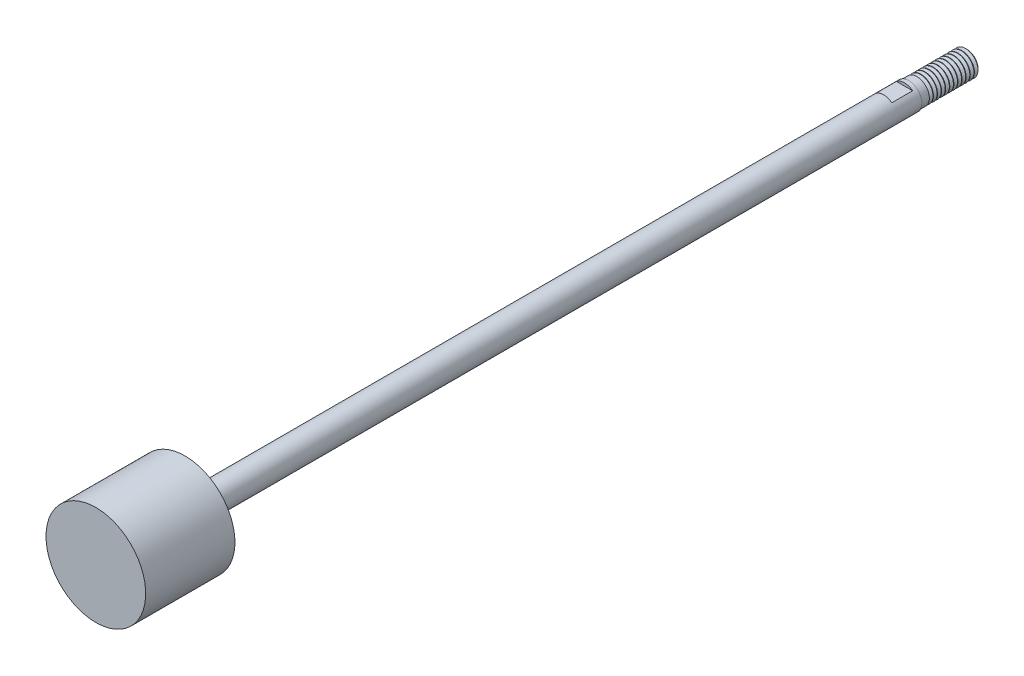
ISO-10303-21;
HEADER;
FILE_DESCRIPTION(('STEP AP214'),'2;1');
FILE_NAME('part.step','',(''),(''),'','','');
FILE_SCHEMA(('AUTOMOTIVE_DESIGN { 1 0 10303 214 1 1 1 1 }'));
ENDSEC;
DATA;
#1=APPLICATION_CONTEXT('core data for automotive mechanical design processes');
#2=APPLICATION_PROTOCOL_DEFINITION('international standard','automotive_design',2000,#1);
#3=PRODUCT_CONTEXT('',#1,'mechanical');
#4=PRODUCT('Part','Part','',(#3));
#5=PRODUCT_RELATED_PRODUCT_CATEGORY('part','',(#4));
#6=PRODUCT_DEFINITION_FORMATION('','',#4);
#7=PRODUCT_DEFINITION_CONTEXT('part definition',#1,'design');
#8=PRODUCT_DEFINITION('design','',#6,#7);
#9=PRODUCT_DEFINITION_SHAPE('','',#8);
#10=(LENGTH_UNIT() NAMED_UNIT(*) SI_UNIT(.MILLI.,.METRE.));
#11=(NAMED_UNIT(*) PLANE_ANGLE_UNIT() SI_UNIT($,.RADIAN.));
#12=(NAMED_UNIT(*) SI_UNIT($,.STERADIAN.) SOLID_ANGLE_UNIT());
#13=UNCERTAINTY_MEASURE_WITH_UNIT(LENGTH_MEASURE(1.E-05),#10,'distance_accuracy_value','');
#14=(GEOMETRIC_REPRESENTATION_CONTEXT(3) GLOBAL_UNCERTAINTY_ASSIGNED_CONTEXT((#13)) GLOBAL_UNIT_ASSIGNED_CONTEXT((#10,
#11,#12)) REPRESENTATION_CONTEXT('',''));
#15=CARTESIAN_POINT('',(0.,0.,0.));
#16=DIRECTION('',(0.,0.,1.));
#17=DIRECTION('',(1.,0.,0.));
#18=AXIS2_PLACEMENT_3D('',#15,#16,#17);
#19=CARTESIAN_POINT('',(0.,0.,0.));
#20=DIRECTION('',(0.,0.,-1.));
#21=DIRECTION('',(-1.,0.,0.));
#22=AXIS2_PLACEMENT_3D('',#19,#20,#21);
#23=PLANE('',#22);
#24=CARTESIAN_POINT('',(0.,0.,-2.8421709430404E-10));
#25=DIRECTION('',(0.,0.,1.));
#26=DIRECTION('',(1.,0.,0.));
#27=AXIS2_PLACEMENT_3D('',#24,#25,#26);
#28=CIRCLE('',#27,2.66992000024402);
#29=CARTESIAN_POINT('',(2.66992000024402,0.,-2.8421709430404E-10));
#30=VERTEX_POINT('',#29);
#31=EDGE_CURVE('E19',#30,#30,#28,.T.);
#32=ORIENTED_EDGE('',*,*,#31,.F.);
#33=EDGE_LOOP('',(#32));
#34=FACE_BOUND('',#33,.T.);
#35=ADVANCED_FACE('F16',(#34),#23,.T.);
#36=CARTESIAN_POINT('',(0.,0.,0.330079999628197));
#37=DIRECTION('',(0.,0.,1.));
#38=DIRECTION('',(1.,0.,0.));
#39=AXIS2_PLACEMENT_3D('',#36,#37,#38);
#40=CONICAL_SURFACE('',#39,2.99999999953116,0.785398162450288);
#41=CARTESIAN_POINT('',(0.,0.,0.33007999968504));
#42=DIRECTION('',(0.,0.,-1.));
#43=DIRECTION('',(-1.,0.,0.));
#44=AXIS2_PLACEMENT_3D('',#41,#42,#43);
#45=CIRCLE('',#44,2.99999999964484);
#46=CARTESIAN_POINT('',(-2.99999999964484,0.,0.33007999968504));
#47=VERTEX_POINT('',#46);
#48=EDGE_CURVE('E196',#47,#47,#45,.F.);
#49=ORIENTED_EDGE('',*,*,#48,.F.);
#50=EDGE_LOOP('',(#49));
#51=FACE_BOUND('',#50,.T.);
#52=ORIENTED_EDGE('',*,*,#31,.T.);
#53=EDGE_LOOP('',(#52));
#54=FACE_BOUND('',#53,.T.);
#55=ADVANCED_FACE('F400',(#51,#54),#40,.T.);
#56=CARTESIAN_POINT('',(0.,0.,0.33007999968504));
#57=DIRECTION('',(0.,0.,-1.));
#58=DIRECTION('',(-1.,0.,0.));
#59=AXIS2_PLACEMENT_3D('',#56,#57,#58);
#60=CONICAL_SURFACE('',#59,2.99999999964484,1.04719755000185);
#61=ORIENTED_EDGE('',*,*,#48,.T.);
#62=EDGE_LOOP('',(#61));
#63=FACE_BOUND('',#62,.T.);
#64=CARTESIAN_POINT('',(0.,0.,0.767579999546797));
#65=DIRECTION('',(0.,0.,1.));
#66=DIRECTION('',(1.,0.,0.));
#67=AXIS2_PLACEMENT_3D('',#64,#65,#66);
#68=CIRCLE('',#67,2.24222777194427);
#69=CARTESIAN_POINT('',(2.24222777194427,0.,0.767579999546797));
#70=VERTEX_POINT('',#69);
#71=EDGE_CURVE('E193',#70,#70,#68,.T.);
#72=ORIENTED_EDGE('',*,*,#71,.F.);
#73=EDGE_LOOP('',(#72));
#74=FACE_BOUND('',#73,.T.);
#75=ADVANCED_FACE('F397',(#63,#74),#60,.T.);
#76=CARTESIAN_POINT('',(0.,0.,1.2050799998633));
#77=DIRECTION('',(0.,0.,1.));
#78=DIRECTION('',(1.,0.,0.));
#79=AXIS2_PLACEMENT_3D('',#76,#77,#78);
#80=CONICAL_SURFACE('',#79,2.99999999884903,1.04719755006448);
#81=CARTESIAN_POINT('',(0.,0.,1.20508));
#82=DIRECTION('',(0.,0.,1.));
#83=DIRECTION('',(1.,0.,0.));
#84=AXIS2_PLACEMENT_3D('',#81,#82,#83);
#85=CIRCLE('',#84,2.99999999999999);
#86=CARTESIAN_POINT('',(2.99999999999999,0.,1.20508));
#87=VERTEX_POINT('',#86);
#88=EDGE_CURVE('E190',#87,#87,#85,.T.);
#89=ORIENTED_EDGE('',*,*,#88,.F.);
#90=EDGE_LOOP('',(#89));
#91=FACE_BOUND('',#90,.T.);
#92=ORIENTED_EDGE('',*,*,#71,.T.);
#93=EDGE_LOOP('',(#92));
#94=FACE_BOUND('',#93,.T.);
#95=ADVANCED_FACE('F393',(#91,#94),#80,.T.);
#96=CARTESIAN_POINT('',(0.,0.,0.));
#97=DIRECTION('',(0.,0.,1.));
#98=DIRECTION('',(1.,0.,0.));
#99=AXIS2_PLACEMENT_3D('',#96,#97,#98);
#100=CYLINDRICAL_SURFACE('',#99,2.99999999999999);
#101=CARTESIAN_POINT('',(0.,0.,1.31445499965821));
#102=DIRECTION('',(0.,0.,-1.));
#103=DIRECTION('',(-1.,0.,0.));
#104=AXIS2_PLACEMENT_3D('',#101,#102,#103);
#105=CIRCLE('',#104,2.99999999975853);
#106=CARTESIAN_POINT('',(-2.99999999975853,0.,1.31445499965821));
#107=VERTEX_POINT('',#106);
#108=EDGE_CURVE('E187',#107,#107,#105,.F.);
#109=ORIENTED_EDGE('',*,*,#108,.F.);
#110=EDGE_LOOP('',(#109));
#111=FACE_BOUND('',#110,.T.);
#112=ORIENTED_EDGE('',*,*,#88,.T.);
#113=EDGE_LOOP('',(#112));
#114=FACE_BOUND('',#113,.T.);
#115=ADVANCED_FACE('F389',(#111,#114),#100,.T.);
#116=CARTESIAN_POINT('',(0.,0.,1.31445499965821));
#117=DIRECTION('',(0.,0.,-1.));
#118=DIRECTION('',(-1.,0.,0.));
#119=AXIS2_PLACEMENT_3D('',#116,#117,#118);
#120=CONICAL_SURFACE('',#119,2.99999999975853,1.04719755001055);
#121=ORIENTED_EDGE('',*,*,#108,.T.);
#122=EDGE_LOOP('',(#121));
#123=FACE_BOUND('',#122,.T.);
#124=CARTESIAN_POINT('',(0.,0.,1.75195499957681));
#125=DIRECTION('',(0.,0.,1.));
#126=DIRECTION('',(1.,0.,0.));
#127=AXIS2_PLACEMENT_3D('',#124,#125,#126);
#128=CIRCLE('',#127,2.24222777194427);
#129=CARTESIAN_POINT('',(2.24222777194427,0.,1.75195499957681));
#130=VERTEX_POINT('',#129);
#131=EDGE_CURVE('E184',#130,#130,#128,.T.);
#132=ORIENTED_EDGE('',*,*,#131,.F.);
#133=EDGE_LOOP('',(#132));
#134=FACE_BOUND('',#133,.T.);
#135=ADVANCED_FACE('F385',(#123,#134),#120,.T.);
#136=CARTESIAN_POINT('',(0.,0.,2.18945499983647));
#137=DIRECTION('',(0.,0.,1.));
#138=DIRECTION('',(1.,0.,0.));
#139=AXIS2_PLACEMENT_3D('',#136,#137,#138);
#140=CONICAL_SURFACE('',#139,2.99999999873535,1.04719755005578);
#141=CARTESIAN_POINT('',(0.,0.,2.18945500000001));
#142=DIRECTION('',(0.,0.,1.));
#143=DIRECTION('',(1.,0.,0.));
#144=AXIS2_PLACEMENT_3D('',#141,#142,#143);
#145=CIRCLE('',#144,2.99999999999999);
#146=CARTESIAN_POINT('',(2.99999999999999,0.,2.18945500000001));
#147=VERTEX_POINT('',#146);
#148=EDGE_CURVE('E181',#147,#147,#145,.T.);
#149=ORIENTED_EDGE('',*,*,#148,.F.);
#150=EDGE_LOOP('',(#149));
#151=FACE_BOUND('',#150,.T.);
#152=ORIENTED_EDGE('',*,*,#131,.T.);
#153=EDGE_LOOP('',(#152));
#154=FACE_BOUND('',#153,.T.);
#155=ADVANCED_FACE('F381',(#151,#154),#140,.T.);
#156=CARTESIAN_POINT('',(0.,0.,0.));
#157=DIRECTION('',(0.,0.,1.));
#158=DIRECTION('',(1.,0.,0.));
#159=AXIS2_PLACEMENT_3D('',#156,#157,#158);
#160=CYLINDRICAL_SURFACE('',#159,2.99999999999999);
#161=CARTESIAN_POINT('',(0.,0.,2.29882999957454));
#162=DIRECTION('',(0.,0.,-1.));
#163=DIRECTION('',(-1.,0.,0.));
#164=AXIS2_PLACEMENT_3D('',#161,#162,#163);
#165=CIRCLE('',#164,2.99999999975853);
#166=CARTESIAN_POINT('',(-2.99999999975853,0.,2.29882999957454));
#167=VERTEX_POINT('',#166);
#168=EDGE_CURVE('E178',#167,#167,#165,.F.);
#169=ORIENTED_EDGE('',*,*,#168,.F.);
#170=EDGE_LOOP('',(#169));
#171=FACE_BOUND('',#170,.T.);
#172=ORIENTED_EDGE('',*,*,#148,.T.);
#173=EDGE_LOOP('',(#172));
#174=FACE_BOUND('',#173,.T.);
#175=ADVANCED_FACE('F377',(#171,#174),#160,.T.);
#176=CARTESIAN_POINT('',(0.,0.,2.29882999968822));
#177=DIRECTION('',(0.,0.,-1.));
#178=DIRECTION('',(-1.,0.,0.));
#179=AXIS2_PLACEMENT_3D('',#176,#177,#178);
#180=CONICAL_SURFACE('',#179,2.999999999588,1.04719755001055);
#181=ORIENTED_EDGE('',*,*,#168,.T.);
#182=EDGE_LOOP('',(#181));
#183=FACE_BOUND('',#182,.T.);
#184=CARTESIAN_POINT('',(0.,0.,2.73632999954998));
#185=DIRECTION('',(0.,0.,1.));
#186=DIRECTION('',(1.,0.,0.));
#187=AXIS2_PLACEMENT_3D('',#184,#185,#186);
#188=CIRCLE('',#187,2.24222777194427);
#189=CARTESIAN_POINT('',(2.24222777194427,0.,2.73632999954998));
#190=VERTEX_POINT('',#189);
#191=EDGE_CURVE('E175',#190,#190,#188,.T.);
#192=ORIENTED_EDGE('',*,*,#191,.F.);
#193=EDGE_LOOP('',(#192));
#194=FACE_BOUND('',#193,.T.);
#195=ADVANCED_FACE('F373',(#183,#194),#180,.T.);
#196=CARTESIAN_POINT('',(0.,0.,3.17382999986648));
#197=DIRECTION('',(0.,0.,1.));
#198=DIRECTION('',(0.,-1.,0.));
#199=AXIS2_PLACEMENT_3D('',#196,#197,#198);
#200=CONICAL_SURFACE('',#199,2.99999999884903,1.04719755006448);
#201=CARTESIAN_POINT('',(0.,0.,3.17383));
#202=DIRECTION('',(0.,0.,1.));
#203=DIRECTION('',(1.,0.,0.));
#204=AXIS2_PLACEMENT_3D('',#201,#202,#203);
#205=CIRCLE('',#204,2.99999999999999);
#206=CARTESIAN_POINT('',(2.99999999999999,0.,3.17383));
#207=VERTEX_POINT('',#206);
#208=EDGE_CURVE('E172',#207,#207,#205,.T.);
#209=ORIENTED_EDGE('',*,*,#208,.F.);
#210=EDGE_LOOP('',(#209));
#211=FACE_BOUND('',#210,.T.);
#212=ORIENTED_EDGE('',*,*,#191,.T.);
#213=EDGE_LOOP('',(#212));
#214=FACE_BOUND('',#213,.T.);
#215=ADVANCED_FACE('F369',(#211,#214),#200,.T.);
#216=CARTESIAN_POINT('',(0.,0.,0.));
#217=DIRECTION('',(0.,0.,1.));
#218=DIRECTION('',(1.,0.,0.));
#219=AXIS2_PLACEMENT_3D('',#216,#217,#218);
#220=CYLINDRICAL_SURFACE('',#219,2.99999999999999);
#221=CARTESIAN_POINT('',(0.,0.,3.28320499966139));
#222=DIRECTION('',(0.,0.,-1.));
#223=DIRECTION('',(-1.,0.,0.));
#224=AXIS2_PLACEMENT_3D('',#221,#222,#223);
#225=CIRCLE('',#224,2.99999999975853);
#226=CARTESIAN_POINT('',(-2.99999999975853,0.,3.28320499966139));
#227=VERTEX_POINT('',#226);
#228=EDGE_CURVE('E169',#227,#227,#225,.F.);
#229=ORIENTED_EDGE('',*,*,#228,.F.);
#230=EDGE_LOOP('',(#229));
#231=FACE_BOUND('',#230,.T.);
#232=ORIENTED_EDGE('',*,*,#208,.T.);
#233=EDGE_LOOP('',(#232));
#234=FACE_BOUND('',#233,.T.);
#235=ADVANCED_FACE('F365',(#231,#234),#220,.T.);
#236=CARTESIAN_POINT('',(0.,0.,3.28320499966139));
#237=DIRECTION('',(0.,0.,-1.));
#238=DIRECTION('',(-1.,0.,0.));
#239=AXIS2_PLACEMENT_3D('',#236,#237,#238);
#240=CONICAL_SURFACE('',#239,2.99999999975853,1.04719755000185);
#241=ORIENTED_EDGE('',*,*,#228,.T.);
#242=EDGE_LOOP('',(#241));
#243=FACE_BOUND('',#242,.T.);
#244=CARTESIAN_POINT('',(0.,0.,3.72070499946631));
#245=DIRECTION('',(0.,0.,1.));
#246=DIRECTION('',(1.,0.,0.));
#247=AXIS2_PLACEMENT_3D('',#244,#245,#246);
#248=CIRCLE('',#247,2.24222777194427);
#249=CARTESIAN_POINT('',(2.24222777194427,0.,3.72070499946631));
#250=VERTEX_POINT('',#249);
#251=EDGE_CURVE('E166',#250,#250,#248,.T.);
#252=ORIENTED_EDGE('',*,*,#251,.F.);
#253=EDGE_LOOP('',(#252));
#254=FACE_BOUND('',#253,.T.);
#255=ADVANCED_FACE('F361',(#243,#254),#240,.T.);
#256=CARTESIAN_POINT('',(0.,0.,4.1582049998965));
#257=DIRECTION('',(0.,0.,1.));
#258=DIRECTION('',(1.,0.,0.));
#259=AXIS2_PLACEMENT_3D('',#256,#257,#258);
#260=CONICAL_SURFACE('',#259,2.99999999890588,1.04719754998444);
#261=CARTESIAN_POINT('',(0.,0.,4.15820500000001));
#262=DIRECTION('',(0.,0.,1.));
#263=DIRECTION('',(1.,0.,0.));
#264=AXIS2_PLACEMENT_3D('',#261,#262,#263);
#265=CIRCLE('',#264,2.99999999999999);
#266=CARTESIAN_POINT('',(2.99999999999999,0.,4.15820500000001));
#267=VERTEX_POINT('',#266);
#268=EDGE_CURVE('E163',#267,#267,#265,.T.);
#269=ORIENTED_EDGE('',*,*,#268,.F.);
#270=EDGE_LOOP('',(#269));
#271=FACE_BOUND('',#270,.T.);
#272=ORIENTED_EDGE('',*,*,#251,.T.);
#273=EDGE_LOOP('',(#272));
#274=FACE_BOUND('',#273,.T.);
#275=ADVANCED_FACE('F357',(#271,#274),#260,.T.);
#276=CARTESIAN_POINT('',(0.,0.,0.));
#277=DIRECTION('',(0.,0.,1.));
#278=DIRECTION('',(1.,0.,0.));
#279=AXIS2_PLACEMENT_3D('',#276,#277,#278);
#280=CYLINDRICAL_SURFACE('',#279,2.99999999999999);
#281=CARTESIAN_POINT('',(0.,0.,4.26757999957772));
#282=DIRECTION('',(0.,0.,-1.));
#283=DIRECTION('',(-1.,0.,0.));
#284=AXIS2_PLACEMENT_3D('',#281,#282,#283);
#285=CIRCLE('',#284,2.99999999981537);
#286=CARTESIAN_POINT('',(-2.99999999981537,0.,4.26757999957772));
#287=VERTEX_POINT('',#286);
#288=EDGE_CURVE('E160',#287,#287,#285,.F.);
#289=ORIENTED_EDGE('',*,*,#288,.F.);
#290=EDGE_LOOP('',(#289));
#291=FACE_BOUND('',#290,.T.);
#292=ORIENTED_EDGE('',*,*,#268,.T.);
#293=EDGE_LOOP('',(#292));
#294=FACE_BOUND('',#293,.T.);
#295=ADVANCED_FACE('F353',(#291,#294),#280,.T.);
#296=CARTESIAN_POINT('',(0.,0.,4.26757999957772));
#297=DIRECTION('',(0.,0.,-1.));
#298=DIRECTION('',(-1.,0.,0.));
#299=AXIS2_PLACEMENT_3D('',#296,#297,#298);
#300=CONICAL_SURFACE('',#299,2.99999999981537,1.04719754998677);
#301=ORIENTED_EDGE('',*,*,#288,.T.);
#302=EDGE_LOOP('',(#301));
#303=FACE_BOUND('',#302,.T.);
#304=CARTESIAN_POINT('',(0.,0.,4.70507999943948));
#305=DIRECTION('',(0.,0.,1.));
#306=DIRECTION('',(1.,0.,0.));
#307=AXIS2_PLACEMENT_3D('',#304,#305,#306);
#308=CIRCLE('',#307,2.24222777194427);
#309=CARTESIAN_POINT('',(2.24222777194427,0.,4.70507999943948));
#310=VERTEX_POINT('',#309);
#311=EDGE_CURVE('E157',#310,#310,#308,.T.);
#312=ORIENTED_EDGE('',*,*,#311,.F.);
#313=EDGE_LOOP('',(#312));
#314=FACE_BOUND('',#313,.T.);
#315=ADVANCED_FACE('F349',(#303,#314),#300,.T.);
#316=CARTESIAN_POINT('',(0.,0.,5.14257999986967));
#317=DIRECTION('',(0.,0.,1.));
#318=DIRECTION('',(1.,0.,0.));
#319=AXIS2_PLACEMENT_3D('',#316,#317,#318);
#320=CONICAL_SURFACE('',#319,2.99999999890588,1.04719754998444);
#321=CARTESIAN_POINT('',(0.,0.,5.14258));
#322=DIRECTION('',(0.,0.,1.));
#323=DIRECTION('',(1.,0.,0.));
#324=AXIS2_PLACEMENT_3D('',#321,#322,#323);
#325=CIRCLE('',#324,2.99999999999999);
#326=CARTESIAN_POINT('',(2.99999999999999,0.,5.14258));
#327=VERTEX_POINT('',#326);
#328=EDGE_CURVE('E154',#327,#327,#325,.T.);
#329=ORIENTED_EDGE('',*,*,#328,.F.);
#330=EDGE_LOOP('',(#329));
#331=FACE_BOUND('',#330,.T.);
#332=ORIENTED_EDGE('',*,*,#311,.T.);
#333=EDGE_LOOP('',(#332));
#334=FACE_BOUND('',#333,.T.);
#335=ADVANCED_FACE('F345',(#331,#334),#320,.T.);
#336=CARTESIAN_POINT('',(0.,0.,0.));
#337=DIRECTION('',(0.,0.,1.));
#338=DIRECTION('',(1.,0.,0.));
#339=AXIS2_PLACEMENT_3D('',#336,#337,#338);
#340=CYLINDRICAL_SURFACE('',#339,2.99999999999999);
#341=CARTESIAN_POINT('',(0.,0.,5.25195499966458));
#342=DIRECTION('',(0.,0.,-1.));
#343=DIRECTION('',(-1.,0.,0.));
#344=AXIS2_PLACEMENT_3D('',#341,#342,#343);
#345=CIRCLE('',#344,2.99999999975853);
#346=CARTESIAN_POINT('',(-2.99999999975853,0.,5.25195499966458));
#347=VERTEX_POINT('',#346);
#348=EDGE_CURVE('E151',#347,#347,#345,.F.);
#349=ORIENTED_EDGE('',*,*,#348,.F.);
#350=EDGE_LOOP('',(#349));
#351=FACE_BOUND('',#350,.T.);
#352=ORIENTED_EDGE('',*,*,#328,.T.);
#353=EDGE_LOOP('',(#352));
#354=FACE_BOUND('',#353,.T.);
#355=ADVANCED_FACE('F341',(#351,#354),#340,.T.);
#356=CARTESIAN_POINT('',(0.,0.,5.25195499966458));
#357=DIRECTION('',(0.,0.,-1.));
#358=DIRECTION('',(-1.,0.,0.));
#359=AXIS2_PLACEMENT_3D('',#356,#357,#358);
#360=CONICAL_SURFACE('',#359,2.99999999975853,1.04719755000185);
#361=ORIENTED_EDGE('',*,*,#348,.T.);
#362=EDGE_LOOP('',(#361));
#363=FACE_BOUND('',#362,.T.);
#364=CARTESIAN_POINT('',(0.,0.,5.68945499946949));
#365=DIRECTION('',(0.,0.,1.));
#366=DIRECTION('',(1.,0.,0.));
#367=AXIS2_PLACEMENT_3D('',#364,#365,#366);
#368=CIRCLE('',#367,2.24222777188743);
#369=CARTESIAN_POINT('',(2.24222777188743,0.,5.68945499946949));
#370=VERTEX_POINT('',#369);
#371=EDGE_CURVE('E148',#370,#370,#368,.T.);
#372=ORIENTED_EDGE('',*,*,#371,.F.);
#373=EDGE_LOOP('',(#372));
#374=FACE_BOUND('',#373,.T.);
#375=ADVANCED_FACE('F337',(#363,#374),#360,.T.);
#376=CARTESIAN_POINT('',(0.,0.,6.12695499984284));
#377=DIRECTION('',(0.,0.,1.));
#378=DIRECTION('',(1.,0.,0.));
#379=AXIS2_PLACEMENT_3D('',#376,#377,#378);
#380=CONICAL_SURFACE('',#379,2.99999999873535,1.04719754997574);
#381=CARTESIAN_POINT('',(0.,0.,6.12695500000001));
#382=DIRECTION('',(0.,0.,1.));
#383=DIRECTION('',(1.,0.,0.));
#384=AXIS2_PLACEMENT_3D('',#381,#382,#383);
#385=CIRCLE('',#384,2.99999999999999);
#386=CARTESIAN_POINT('',(2.99999999999999,0.,6.12695500000001));
#387=VERTEX_POINT('',#386);
#388=EDGE_CURVE('E145',#387,#387,#385,.T.);
#389=ORIENTED_EDGE('',*,*,#388,.F.);
#390=EDGE_LOOP('',(#389));
#391=FACE_BOUND('',#390,.T.);
#392=ORIENTED_EDGE('',*,*,#371,.T.);
#393=EDGE_LOOP('',(#392));
#394=FACE_BOUND('',#393,.T.);
#395=ADVANCED_FACE('F333',(#391,#394),#380,.T.);
#396=CARTESIAN_POINT('',(0.,0.,0.));
#397=DIRECTION('',(0.,0.,1.));
#398=DIRECTION('',(1.,0.,0.));
#399=AXIS2_PLACEMENT_3D('',#396,#397,#398);
#400=CYLINDRICAL_SURFACE('',#399,2.99999999999999);
#401=CARTESIAN_POINT('',(0.,0.,6.2363299995809));
#402=DIRECTION('',(0.,0.,-1.));
#403=DIRECTION('',(0.,1.,0.));
#404=AXIS2_PLACEMENT_3D('',#401,#402,#403);
#405=CIRCLE('',#404,2.99999999981537);
#406=CARTESIAN_POINT('',(0.,2.99999999981537,6.2363299995809));
#407=VERTEX_POINT('',#406);
#408=EDGE_CURVE('E142',#407,#407,#405,.F.);
#409=ORIENTED_EDGE('',*,*,#408,.F.);
#410=EDGE_LOOP('',(#409));
#411=FACE_BOUND('',#410,.T.);
#412=ORIENTED_EDGE('',*,*,#388,.T.);
#413=EDGE_LOOP('',(#412));
#414=FACE_BOUND('',#413,.T.);
#415=ADVANCED_FACE('F329',(#411,#414),#400,.T.);
#416=CARTESIAN_POINT('',(0.,0.,6.2363299995809));
#417=DIRECTION('',(0.,0.,-1.));
#418=DIRECTION('',(-1.,0.,0.));
#419=AXIS2_PLACEMENT_3D('',#416,#417,#418);
#420=CONICAL_SURFACE('',#419,2.99999999981537,1.04719755001055);
#421=ORIENTED_EDGE('',*,*,#408,.T.);
#422=EDGE_LOOP('',(#421));
#423=FACE_BOUND('',#422,.T.);
#424=CARTESIAN_POINT('',(0.,0.,6.6738299994995));
#425=DIRECTION('',(0.,0.,1.));
#426=DIRECTION('',(0.,-1.,0.));
#427=AXIS2_PLACEMENT_3D('',#424,#425,#426);
#428=CIRCLE('',#427,2.24222777183059);
#429=CARTESIAN_POINT('',(0.,-2.24222777183058,6.6738299994995));
#430=VERTEX_POINT('',#429);
#431=EDGE_CURVE('E139',#430,#430,#428,.T.);
#432=ORIENTED_EDGE('',*,*,#431,.F.);
#433=EDGE_LOOP('',(#432));
#434=FACE_BOUND('',#433,.T.);
#435=ADVANCED_FACE('F325',(#423,#434),#420,.T.);
#436=CARTESIAN_POINT('',(0.,0.,7.11133000038444));
#437=DIRECTION('',(0.,0.,1.));
#438=DIRECTION('',(1.,0.,0.));
#439=AXIS2_PLACEMENT_3D('',#436,#437,#438);
#440=CONICAL_SURFACE('',#439,2.999999999588,1.04719754998911);
#441=CARTESIAN_POINT('',(0.,0.,7.11133));
#442=DIRECTION('',(0.,0.,1.));
#443=DIRECTION('',(1.,0.,0.));
#444=AXIS2_PLACEMENT_3D('',#441,#442,#443);
#445=CIRCLE('',#444,2.99999999999999);
#446=CARTESIAN_POINT('',(2.99999999999999,0.,7.11133));
#447=VERTEX_POINT('',#446);
#448=EDGE_CURVE('E136',#447,#447,#445,.T.);
#449=ORIENTED_EDGE('',*,*,#448,.F.);
#450=EDGE_LOOP('',(#449));
#451=FACE_BOUND('',#450,.T.);
#452=ORIENTED_EDGE('',*,*,#431,.T.);
#453=EDGE_LOOP('',(#452));
#454=FACE_BOUND('',#453,.T.);
#455=ADVANCED_FACE('F321',(#451,#454),#440,.T.);
#456=CARTESIAN_POINT('',(0.,0.,0.));
#457=DIRECTION('',(0.,0.,1.));
#458=DIRECTION('',(1.,0.,0.));
#459=AXIS2_PLACEMENT_3D('',#456,#457,#458);
#460=CYLINDRICAL_SURFACE('',#459,2.99999999999999);
#461=ORIENTED_EDGE('',*,*,#448,.T.);
#462=EDGE_LOOP('',(#461));
#463=FACE_BOUND('',#462,.T.);
#464=CARTESIAN_POINT('',(0.,0.,7.22070499955407));
#465=DIRECTION('',(0.,0.,-1.));
#466=DIRECTION('',(-1.,0.,0.));
#467=AXIS2_PLACEMENT_3D('',#464,#465,#466);
#468=CIRCLE('',#467,2.99999999981537);
#469=CARTESIAN_POINT('',(-2.99999999981537,0.,7.22070499955407));
#470=VERTEX_POINT('',#469);
#471=EDGE_CURVE('E133',#470,#470,#468,.F.);
#472=ORIENTED_EDGE('',*,*,#471,.F.);
#473=EDGE_LOOP('',(#472));
#474=FACE_BOUND('',#473,.T.);
#475=ADVANCED_FACE('F317',(#463,#474),#460,.T.);
#476=CARTESIAN_POINT('',(0.,0.,7.22070499955407));
#477=DIRECTION('',(0.,0.,-1.));
#478=DIRECTION('',(-1.,0.,0.));
#479=AXIS2_PLACEMENT_3D('',#476,#477,#478);
#480=CONICAL_SURFACE('',#479,2.99999999981537,1.04719754998677);
#481=CARTESIAN_POINT('',(0.,0.,7.65820499941583));
#482=DIRECTION('',(0.,0.,1.));
#483=DIRECTION('',(1.,0.,0.));
#484=AXIS2_PLACEMENT_3D('',#481,#482,#483);
#485=CIRCLE('',#484,2.24222777188743);
#486=CARTESIAN_POINT('',(2.24222777188743,0.,7.65820499941583));
#487=VERTEX_POINT('',#486);
#488=EDGE_CURVE('E130',#487,#487,#485,.T.);
#489=ORIENTED_EDGE('',*,*,#488,.F.);
#490=EDGE_LOOP('',(#489));
#491=FACE_BOUND('',#490,.T.);
#492=ORIENTED_EDGE('',*,*,#471,.T.);
#493=EDGE_LOOP('',(#492));
#494=FACE_BOUND('',#493,.T.);
#495=ADVANCED_FACE('F313',(#491,#494),#480,.T.);
#496=CARTESIAN_POINT('',(0.,0.,8.09570499984602));
#497=DIRECTION('',(0.,0.,1.));
#498=DIRECTION('',(1.,0.,0.));
#499=AXIS2_PLACEMENT_3D('',#496,#497,#498);
#500=CONICAL_SURFACE('',#499,2.99999999884903,1.04719754998444);
#501=ORIENTED_EDGE('',*,*,#488,.T.);
#502=EDGE_LOOP('',(#501));
#503=FACE_BOUND('',#502,.T.);
#504=CARTESIAN_POINT('',(0.,0.,8.09570500000001));
#505=DIRECTION('',(0.,0.,1.));
#506=DIRECTION('',(1.,0.,0.));
#507=AXIS2_PLACEMENT_3D('',#504,#505,#506);
#508=CIRCLE('',#507,2.99999999999999);
#509=CARTESIAN_POINT('',(2.99999999999999,0.,8.09570500000001));
#510=VERTEX_POINT('',#509);
#511=EDGE_CURVE('E127',#510,#510,#508,.T.);
#512=ORIENTED_EDGE('',*,*,#511,.F.);
#513=EDGE_LOOP('',(#512));
#514=FACE_BOUND('',#513,.T.);
#515=ADVANCED_FACE('F309',(#503,#514),#500,.T.);
#516=CARTESIAN_POINT('',(0.,0.,0.));
#517=DIRECTION('',(0.,0.,1.));
#518=DIRECTION('',(1.,0.,0.));
#519=AXIS2_PLACEMENT_3D('',#516,#517,#518);
#520=CYLINDRICAL_SURFACE('',#519,2.99999999999999);
#521=ORIENTED_EDGE('',*,*,#511,.T.);
#522=EDGE_LOOP('',(#521));
#523=FACE_BOUND('',#522,.T.);
#524=CARTESIAN_POINT('',(0.,0.,8.20507999952724));
#525=DIRECTION('',(0.,0.,-1.));
#526=DIRECTION('',(-1.,0.,0.));
#527=AXIS2_PLACEMENT_3D('',#524,#525,#526);
#528=CIRCLE('',#527,2.99999999975853);
#529=CARTESIAN_POINT('',(-2.99999999975853,0.,8.20507999952724));
#530=VERTEX_POINT('',#529);
#531=EDGE_CURVE('E124',#530,#530,#528,.F.);
#532=ORIENTED_EDGE('',*,*,#531,.F.);
#533=EDGE_LOOP('',(#532));
#534=FACE_BOUND('',#533,.T.);
#535=ADVANCED_FACE('F305',(#523,#534),#520,.T.);
#536=CARTESIAN_POINT('',(0.,0.,8.20507999958409));
#537=DIRECTION('',(0.,0.,-1.));
#538=DIRECTION('',(-1.,0.,0.));
#539=AXIS2_PLACEMENT_3D('',#536,#537,#538);
#540=CONICAL_SURFACE('',#539,2.99999999970169,1.04719755001055);
#541=CARTESIAN_POINT('',(0.,0.,8.64257999944584));
#542=DIRECTION('',(0.,0.,1.));
#543=DIRECTION('',(1.,0.,0.));
#544=AXIS2_PLACEMENT_3D('',#541,#542,#543);
#545=CIRCLE('',#544,2.24222777188743);
#546=CARTESIAN_POINT('',(2.24222777188743,0.,8.64257999944584));
#547=VERTEX_POINT('',#546);
#548=EDGE_CURVE('E121',#547,#547,#545,.T.);
#549=ORIENTED_EDGE('',*,*,#548,.F.);
#550=EDGE_LOOP('',(#549));
#551=FACE_BOUND('',#550,.T.);
#552=ORIENTED_EDGE('',*,*,#531,.T.);
#553=EDGE_LOOP('',(#552));
#554=FACE_BOUND('',#553,.T.);
#555=ADVANCED_FACE('F301',(#551,#554),#540,.T.);
#556=CARTESIAN_POINT('',(0.,0.,9.08007999981919));
#557=DIRECTION('',(0.,0.,1.));
#558=DIRECTION('',(1.,0.,0.));
#559=AXIS2_PLACEMENT_3D('',#556,#557,#558);
#560=CONICAL_SURFACE('',#559,2.99999999873535,1.04719754997574);
#561=ORIENTED_EDGE('',*,*,#548,.T.);
#562=EDGE_LOOP('',(#561));
#563=FACE_BOUND('',#562,.T.);
#564=CARTESIAN_POINT('',(0.,0.,9.08008));
#565=DIRECTION('',(0.,0.,1.));
#566=DIRECTION('',(1.,0.,0.));
#567=AXIS2_PLACEMENT_3D('',#564,#565,#566);
#568=CIRCLE('',#567,2.99999999999999);
#569=CARTESIAN_POINT('',(2.99999999999999,0.,9.08008));
#570=VERTEX_POINT('',#569);
#571=EDGE_CURVE('E118',#570,#570,#568,.T.);
#572=ORIENTED_EDGE('',*,*,#571,.F.);
#573=EDGE_LOOP('',(#572));
#574=FACE_BOUND('',#573,.T.);
#575=ADVANCED_FACE('F297',(#563,#574),#560,.T.);
#576=CARTESIAN_POINT('',(0.,0.,0.));
#577=DIRECTION('',(0.,0.,1.));
#578=DIRECTION('',(1.,0.,0.));
#579=AXIS2_PLACEMENT_3D('',#576,#577,#578);
#580=CYLINDRICAL_SURFACE('',#579,2.99999999999999);
#581=ORIENTED_EDGE('',*,*,#571,.T.);
#582=EDGE_LOOP('',(#581));
#583=FACE_BOUND('',#582,.T.);
#584=CARTESIAN_POINT('',(0.,0.,9.18945499950041));
#585=DIRECTION('',(0.,0.,-1.));
#586=DIRECTION('',(-1.,0.,0.));
#587=AXIS2_PLACEMENT_3D('',#584,#585,#586);
#588=CIRCLE('',#587,2.99999999975853);
#589=CARTESIAN_POINT('',(-2.99999999975853,0.,9.18945499950041));
#590=VERTEX_POINT('',#589);
#591=EDGE_CURVE('E115',#590,#590,#588,.F.);
#592=ORIENTED_EDGE('',*,*,#591,.F.);
#593=EDGE_LOOP('',(#592));
#594=FACE_BOUND('',#593,.T.);
#595=ADVANCED_FACE('F293',(#583,#594),#580,.T.);
#596=CARTESIAN_POINT('',(0.,0.,9.18945499955726));
#597=DIRECTION('',(0.,0.,-1.));
#598=DIRECTION('',(-1.,0.,0.));
#599=AXIS2_PLACEMENT_3D('',#596,#597,#598);
#600=CONICAL_SURFACE('',#599,2.99999999970169,1.04719755001055);
#601=CARTESIAN_POINT('',(0.,0.,9.62695499958954));
#602=DIRECTION('',(0.,0.,1.));
#603=DIRECTION('',(1.,0.,0.));
#604=AXIS2_PLACEMENT_3D('',#601,#602,#603);
#605=CIRCLE('',#604,2.24222777200112);
#606=CARTESIAN_POINT('',(2.24222777200112,0.,9.62695499958954));
#607=VERTEX_POINT('',#606);
#608=EDGE_CURVE('E112',#607,#607,#605,.T.);
#609=ORIENTED_EDGE('',*,*,#608,.F.);
#610=EDGE_LOOP('',(#609));
#611=FACE_BOUND('',#610,.T.);
#612=ORIENTED_EDGE('',*,*,#591,.T.);
#613=EDGE_LOOP('',(#612));
#614=FACE_BOUND('',#613,.T.);
#615=ADVANCED_FACE('F289',(#611,#614),#600,.T.);
#616=CARTESIAN_POINT('',(0.,0.,10.0644550000197));
#617=DIRECTION('',(0.,0.,1.));
#618=DIRECTION('',(1.,0.,0.));
#619=AXIS2_PLACEMENT_3D('',#616,#617,#618);
#620=CONICAL_SURFACE('',#619,2.99999999896272,1.04719754999952);
#621=ORIENTED_EDGE('',*,*,#608,.T.);
#622=EDGE_LOOP('',(#621));
#623=FACE_BOUND('',#622,.T.);
#624=CARTESIAN_POINT('',(0.,0.,10.064455));
#625=DIRECTION('',(0.,0.,1.));
#626=DIRECTION('',(1.,0.,0.));
#627=AXIS2_PLACEMENT_3D('',#624,#625,#626);
#628=CIRCLE('',#627,2.99999999999999);
#629=CARTESIAN_POINT('',(2.99999999999999,0.,10.064455));
#630=VERTEX_POINT('',#629);
#631=EDGE_CURVE('E109',#630,#630,#628,.T.);
#632=ORIENTED_EDGE('',*,*,#631,.F.);
#633=EDGE_LOOP('',(#632));
#634=FACE_BOUND('',#633,.T.);
#635=ADVANCED_FACE('F285',(#623,#634),#620,.T.);
#636=CARTESIAN_POINT('',(0.,0.,0.));
#637=DIRECTION('',(0.,0.,1.));
#638=DIRECTION('',(1.,0.,0.));
#639=AXIS2_PLACEMENT_3D('',#636,#637,#638);
#640=CYLINDRICAL_SURFACE('',#639,2.99999999999999);
#641=ORIENTED_EDGE('',*,*,#631,.T.);
#642=EDGE_LOOP('',(#641));
#643=FACE_BOUND('',#642,.T.);
#644=CARTESIAN_POINT('',(0.,0.,10.1738299994736));
#645=DIRECTION('',(0.,0.,-1.));
#646=DIRECTION('',(-1.,0.,0.));
#647=AXIS2_PLACEMENT_3D('',#644,#645,#646);
#648=CIRCLE('',#647,2.99999999975853);
#649=CARTESIAN_POINT('',(-2.99999999975853,0.,10.1738299994736));
#650=VERTEX_POINT('',#649);
#651=EDGE_CURVE('E106',#650,#650,#648,.F.);
#652=ORIENTED_EDGE('',*,*,#651,.F.);
#653=EDGE_LOOP('',(#652));
#654=FACE_BOUND('',#653,.T.);
#655=ADVANCED_FACE('F281',(#643,#654),#640,.T.);
#656=CARTESIAN_POINT('',(0.,0.,10.1738299995304));
#657=DIRECTION('',(0.,0.,-1.));
#658=DIRECTION('',(-1.,0.,0.));
#659=AXIS2_PLACEMENT_3D('',#656,#657,#658);
#660=CONICAL_SURFACE('',#659,2.99999999970169,1.04719755001055);
#661=CARTESIAN_POINT('',(0.,0.,10.6113299996196));
#662=DIRECTION('',(0.,0.,1.));
#663=DIRECTION('',(1.,0.,0.));
#664=AXIS2_PLACEMENT_3D('',#661,#662,#663);
#665=CIRCLE('',#664,2.24222777200112);
#666=CARTESIAN_POINT('',(2.24222777200112,0.,10.6113299996196));
#667=VERTEX_POINT('',#666);
#668=EDGE_CURVE('E103',#667,#667,#665,.T.);
#669=ORIENTED_EDGE('',*,*,#668,.F.);
#670=EDGE_LOOP('',(#669));
#671=FACE_BOUND('',#670,.T.);
#672=ORIENTED_EDGE('',*,*,#651,.T.);
#673=EDGE_LOOP('',(#672));
#674=FACE_BOUND('',#673,.T.);
#675=ADVANCED_FACE('F277',(#671,#674),#660,.T.);
#676=CARTESIAN_POINT('',(0.,0.,11.0488299999929));
#677=DIRECTION('',(0.,0.,1.));
#678=DIRECTION('',(1.,0.,0.));
#679=AXIS2_PLACEMENT_3D('',#676,#677,#678);
#680=CONICAL_SURFACE('',#679,2.99999999884903,1.04719754999081);
#681=ORIENTED_EDGE('',*,*,#668,.T.);
#682=EDGE_LOOP('',(#681));
#683=FACE_BOUND('',#682,.T.);
#684=CARTESIAN_POINT('',(0.,0.,11.04883));
#685=DIRECTION('',(0.,0.,1.));
#686=DIRECTION('',(1.,0.,0.));
#687=AXIS2_PLACEMENT_3D('',#684,#685,#686);
#688=CIRCLE('',#687,2.99999999999999);
#689=CARTESIAN_POINT('',(2.99999999999999,0.,11.04883));
#690=VERTEX_POINT('',#689);
#691=EDGE_CURVE('E100',#690,#690,#688,.T.);
#692=ORIENTED_EDGE('',*,*,#691,.F.);
#693=EDGE_LOOP('',(#692));
#694=FACE_BOUND('',#693,.T.);
#695=ADVANCED_FACE('F273',(#683,#694),#680,.T.);
#696=CARTESIAN_POINT('',(0.,0.,0.));
#697=DIRECTION('',(0.,0.,1.));
#698=DIRECTION('',(1.,0.,0.));
#699=AXIS2_PLACEMENT_3D('',#696,#697,#698);
#700=CYLINDRICAL_SURFACE('',#699,2.99999999999999);
#701=ORIENTED_EDGE('',*,*,#691,.T.);
#702=EDGE_LOOP('',(#701));
#703=FACE_BOUND('',#702,.T.);
#704=CARTESIAN_POINT('',(0.,0.,11.1582049995604));
#705=DIRECTION('',(0.,0.,-1.));
#706=DIRECTION('',(-1.,0.,0.));
#707=AXIS2_PLACEMENT_3D('',#704,#705,#706);
#708=CIRCLE('',#707,2.99999999981537);
#709=CARTESIAN_POINT('',(-2.99999999981537,0.,11.1582049995604));
#710=VERTEX_POINT('',#709);
#711=EDGE_CURVE('E95',#710,#710,#708,.F.);
#712=ORIENTED_EDGE('',*,*,#711,.F.);
#713=EDGE_LOOP('',(#712));
#714=FACE_BOUND('',#713,.T.);
#715=ADVANCED_FACE('F269',(#703,#714),#700,.T.);
#716=CARTESIAN_POINT('',(0.,0.,11.1582049996741));
#717=DIRECTION('',(0.,0.,-1.));
#718=DIRECTION('',(-1.,0.,0.));
#719=AXIS2_PLACEMENT_3D('',#716,#717,#718);
#720=CONICAL_SURFACE('',#719,2.999999999588,1.04719754997807);
#721=CARTESIAN_POINT('',(0.,0.,11.5957049995927));
#722=DIRECTION('',(0.,0.,1.));
#723=DIRECTION('',(1.,0.,0.));
#724=AXIS2_PLACEMENT_3D('',#721,#722,#723);
#725=CIRCLE('',#724,2.24222777200112);
#726=CARTESIAN_POINT('',(2.24222777200112,0.,11.5957049995927));
#727=VERTEX_POINT('',#726);
#728=EDGE_CURVE('E90',#727,#727,#725,.T.);
#729=ORIENTED_EDGE('',*,*,#728,.F.);
#730=EDGE_LOOP('',(#729));
#731=FACE_BOUND('',#730,.T.);
#732=ORIENTED_EDGE('',*,*,#711,.T.);
#733=EDGE_LOOP('',(#732));
#734=FACE_BOUND('',#733,.T.);
#735=ADVANCED_FACE('F265',(#731,#734),#720,.T.);
#736=CARTESIAN_POINT('',(0.,0.,12.0332050000229));
#737=DIRECTION('',(0.,0.,1.));
#738=DIRECTION('',(1.,0.,0.));
#739=AXIS2_PLACEMENT_3D('',#736,#737,#738);
#740=CONICAL_SURFACE('',#739,2.99999999896272,1.04719754999952);
#741=ORIENTED_EDGE('',*,*,#728,.T.);
#742=EDGE_LOOP('',(#741));
#743=FACE_BOUND('',#742,.T.);
#744=CARTESIAN_POINT('',(0.,0.,12.033205));
#745=DIRECTION('',(0.,0.,1.));
#746=DIRECTION('',(1.,0.,0.));
#747=AXIS2_PLACEMENT_3D('',#744,#745,#746);
#748=CIRCLE('',#747,2.99999999999999);
#749=CARTESIAN_POINT('',(2.99999999999999,0.,12.033205));
#750=VERTEX_POINT('',#749);
#751=EDGE_CURVE('E86',#750,#750,#748,.T.);
#752=ORIENTED_EDGE('',*,*,#751,.F.);
#753=EDGE_LOOP('',(#752));
#754=FACE_BOUND('',#753,.T.);
#755=ADVANCED_FACE('F258',(#743,#754),#740,.T.);
#756=CARTESIAN_POINT('',(0.,0.,209.51619895));
#757=DIRECTION('',(0.,0.,-1.));
#758=DIRECTION('',(-1.,0.,0.));
#759=AXIS2_PLACEMENT_3D('',#756,#757,#758);
#760=PLANE('',#759);
#761=CARTESIAN_POINT('',(0.,0.,209.51619895));
#762=DIRECTION('',(0.,0.,-1.));
#763=DIRECTION('',(-1.,0.,0.));
#764=AXIS2_PLACEMENT_3D('',#761,#762,#763);
#765=CIRCLE('',#764,11.9888);
#766=CARTESIAN_POINT('',(-11.9888,0.,209.51619895));
#767=VERTEX_POINT('',#766);
#768=EDGE_CURVE('E62',#767,#767,#765,.T.);
#769=ORIENTED_EDGE('',*,*,#768,.F.);
#770=EDGE_LOOP('',(#769));
#771=FACE_BOUND('',#770,.T.);
#772=ADVANCED_FACE('F251',(#771),#760,.F.);
#773=CARTESIAN_POINT('',(0.,0.,0.));
#774=DIRECTION('',(0.,0.,1.));
#775=DIRECTION('',(1.,0.,0.));
#776=AXIS2_PLACEMENT_3D('',#773,#774,#775);
#777=CYLINDRICAL_SURFACE('',#776,2.99999999999999);
#778=ORIENTED_EDGE('',*,*,#751,.T.);
#779=EDGE_LOOP('',(#778));
#780=FACE_BOUND('',#779,.T.);
#781=CARTESIAN_POINT('',(0.,0.,14.));
#782=DIRECTION('',(0.,0.,1.));
#783=DIRECTION('',(1.,0.,0.));
#784=AXIS2_PLACEMENT_3D('',#781,#782,#783);
#785=CIRCLE('',#784,2.99999999999999);
#786=CARTESIAN_POINT('',(2.99999999999999,0.,14.));
#787=VERTEX_POINT('',#786);
#788=EDGE_CURVE('E83',#787,#787,#785,.F.);
#789=ORIENTED_EDGE('',*,*,#788,.T.);
#790=EDGE_LOOP('',(#789));
#791=FACE_BOUND('',#790,.T.);
#792=ADVANCED_FACE('F248',(#780,#791),#777,.T.);
#793=CARTESIAN_POINT('',(0.,0.,209.51619895));
#794=DIRECTION('',(0.,0.,-1.));
#795=DIRECTION('',(-1.,0.,0.));
#796=AXIS2_PLACEMENT_3D('',#793,#794,#795);
#797=CYLINDRICAL_SURFACE('',#796,11.9888);
#798=ORIENTED_EDGE('',*,*,#768,.T.);
#799=EDGE_LOOP('',(#798));
#800=FACE_BOUND('',#799,.T.);
#801=CARTESIAN_POINT('',(0.,0.,188.05319895));
#802=DIRECTION('',(0.,0.,-1.));
#803=DIRECTION('',(-1.,0.,0.));
#804=AXIS2_PLACEMENT_3D('',#801,#802,#803);
#805=CIRCLE('',#804,11.9888);
#806=CARTESIAN_POINT('',(-11.9888,0.,188.05319895));
#807=VERTEX_POINT('',#806);
#808=EDGE_CURVE('E76',#807,#807,#805,.T.);
#809=ORIENTED_EDGE('',*,*,#808,.F.);
#810=EDGE_LOOP('',(#809));
#811=FACE_BOUND('',#810,.T.);
#812=ADVANCED_FACE('F250',(#800,#811),#797,.T.);
#813=CARTESIAN_POINT('',(0.,-2.70694030390145,15.));
#814=DIRECTION('',(0.,0.,1.));
#815=DIRECTION('',(1.,0.,0.));
#816=AXIS2_PLACEMENT_3D('',#813,#814,#815);
#817=PLANE('',#816);
#818=CARTESIAN_POINT('',(0.,0.,15.));
#819=DIRECTION('',(0.,0.,1.));
#820=DIRECTION('',(1.,0.,0.));
#821=AXIS2_PLACEMENT_3D('',#818,#819,#820);
#822=CIRCLE('',#821,3.16992);
#823=CARTESIAN_POINT('',(1.94894658890385,-2.50000000000001,15.));
#824=VERTEX_POINT('',#823);
#825=CARTESIAN_POINT('',(-1.94894658890385,-2.50000000000001,15.));
#826=VERTEX_POINT('',#825);
#827=EDGE_CURVE('E59',#824,#826,#822,.F.);
#828=ORIENTED_EDGE('',*,*,#827,.F.);
#829=DIRECTION('',(1.,0.,0.));
#830=VECTOR('',#829,1.);
#831=CARTESIAN_POINT('',(-1.94894658890385,-2.50000000000001,15.));
#832=LINE('',#831,#830);
#833=EDGE_CURVE('E54',#824,#826,#832,.F.);
#834=ORIENTED_EDGE('',*,*,#833,.T.);
#835=EDGE_LOOP('',(#828,#834));
#836=FACE_BOUND('',#835,.T.);
#837=ADVANCED_FACE('F57',(#836),#817,.T.);
#838=CARTESIAN_POINT('',(-1.94894658890385,-2.50000000000001,15.));
#839=DIRECTION('',(0.,1.,0.));
#840=DIRECTION('',(0.,0.,1.));
#841=AXIS2_PLACEMENT_3D('',#838,#839,#840);
#842=PLANE('',#841);
#843=ORIENTED_EDGE('',*,*,#833,.F.);
#844=DIRECTION('',(0.,0.,1.));
#845=VECTOR('',#844,1.);
#846=CARTESIAN_POINT('',(1.94894658890385,-2.50000000000001,0.));
#847=LINE('',#846,#845);
#848=CARTESIAN_POINT('',(1.94894658890385,-2.50000000000001,20.));
#849=VERTEX_POINT('',#848);
#850=EDGE_CURVE('E74',#849,#824,#847,.F.);
#851=ORIENTED_EDGE('',*,*,#850,.F.);
#852=DIRECTION('',(1.,0.,0.));
#853=VECTOR('',#852,1.);
#854=CARTESIAN_POINT('',(0.,-2.50000000000001,20.));
#855=LINE('',#854,#853);
#856=CARTESIAN_POINT('',(-1.94894658890385,-2.50000000000001,20.));
#857=VERTEX_POINT('',#856);
#858=EDGE_CURVE('E61',#849,#857,#855,.F.);
#859=ORIENTED_EDGE('',*,*,#858,.T.);
#860=DIRECTION('',(0.,0.,1.));
#861=VECTOR('',#860,1.);
#862=CARTESIAN_POINT('',(-1.94894658890385,-2.50000000000001,0.));
#863=LINE('',#862,#861);
#864=EDGE_CURVE('E65',#826,#857,#863,.T.);
#865=ORIENTED_EDGE('',*,*,#864,.F.);
#866=EDGE_LOOP('',(#843,#851,#859,#865));
#867=FACE_BOUND('',#866,.T.);
#868=ADVANCED_FACE('F66',(#867),#842,.F.);
#869=CARTESIAN_POINT('',(0.,-2.70694030390145,20.));
#870=DIRECTION('',(0.,0.,1.));
#871=DIRECTION('',(1.,0.,0.));
#872=AXIS2_PLACEMENT_3D('',#869,#870,#871);
#873=PLANE('',#872);
#874=ORIENTED_EDGE('',*,*,#858,.F.);
#875=CARTESIAN_POINT('',(0.,0.,20.));
#876=DIRECTION('',(0.,0.,1.));
#877=DIRECTION('',(1.,0.,0.));
#878=AXIS2_PLACEMENT_3D('',#875,#876,#877);
#879=CIRCLE('',#878,3.16992);
#880=EDGE_CURVE('E71',#857,#849,#879,.T.);
#881=ORIENTED_EDGE('',*,*,#880,.F.);
#882=EDGE_LOOP('',(#874,#881));
#883=FACE_BOUND('',#882,.T.);
#884=ADVANCED_FACE('F699',(#883),#873,.F.);
#885=CARTESIAN_POINT('',(0.,2.70694030390145,15.));
#886=DIRECTION('',(0.,0.,1.));
#887=DIRECTION('',(1.,0.,0.));
#888=AXIS2_PLACEMENT_3D('',#885,#886,#887);
#889=PLANE('',#888);
#890=CARTESIAN_POINT('',(0.,0.,15.));
#891=DIRECTION('',(0.,0.,1.));
#892=DIRECTION('',(1.,0.,0.));
#893=AXIS2_PLACEMENT_3D('',#890,#891,#892);
#894=CIRCLE('',#893,3.16992);
#895=CARTESIAN_POINT('',(-1.94894658890385,2.50000000000001,15.));
#896=VERTEX_POINT('',#895);
#897=CARTESIAN_POINT('',(1.94894658890385,2.50000000000001,15.));
#898=VERTEX_POINT('',#897);
#899=EDGE_CURVE('E204',#896,#898,#894,.F.);
#900=ORIENTED_EDGE('',*,*,#899,.F.);
#901=DIRECTION('',(1.,0.,0.));
#902=VECTOR('',#901,1.);
#903=CARTESIAN_POINT('',(1.94894658890385,2.50000000000001,15.));
#904=LINE('',#903,#902);
#905=EDGE_CURVE('E215',#896,#898,#904,.T.);
#906=ORIENTED_EDGE('',*,*,#905,.T.);
#907=EDGE_LOOP('',(#900,#906));
#908=FACE_BOUND('',#907,.T.);
#909=ADVANCED_FACE('F218',(#908),#889,.T.);
#910=CARTESIAN_POINT('',(1.94894658890385,2.50000000000001,15.));
#911=DIRECTION('',(0.,-1.,0.));
#912=DIRECTION('',(0.,0.,-1.));
#913=AXIS2_PLACEMENT_3D('',#910,#911,#912);
#914=PLANE('',#913);
#915=ORIENTED_EDGE('',*,*,#905,.F.);
#916=DIRECTION('',(0.,0.,1.));
#917=VECTOR('',#916,1.);
#918=CARTESIAN_POINT('',(-1.94894658890385,2.50000000000001,0.));
#919=LINE('',#918,#917);
#920=CARTESIAN_POINT('',(-1.94894658890385,2.50000000000001,20.));
#921=VERTEX_POINT('',#920);
#922=EDGE_CURVE('E206',#921,#896,#919,.F.);
#923=ORIENTED_EDGE('',*,*,#922,.F.);
#924=DIRECTION('',(1.,0.,0.));
#925=VECTOR('',#924,1.);
#926=CARTESIAN_POINT('',(0.,2.50000000000001,20.));
#927=LINE('',#926,#925);
#928=CARTESIAN_POINT('',(1.94894658890385,2.50000000000001,20.));
#929=VERTEX_POINT('',#928);
#930=EDGE_CURVE('E34',#921,#929,#927,.T.);
#931=ORIENTED_EDGE('',*,*,#930,.T.);
#932=DIRECTION('',(0.,0.,1.));
#933=VECTOR('',#932,1.);
#934=CARTESIAN_POINT('',(1.94894658890385,2.50000000000001,0.));
#935=LINE('',#934,#933);
#936=EDGE_CURVE('E203',#898,#929,#935,.T.);
#937=ORIENTED_EDGE('',*,*,#936,.F.);
#938=EDGE_LOOP('',(#915,#923,#931,#937));
#939=FACE_BOUND('',#938,.T.);
#940=ADVANCED_FACE('F219',(#939),#914,.F.);
#941=CARTESIAN_POINT('',(0.,2.70694030390145,20.));
#942=DIRECTION('',(0.,0.,1.));
#943=DIRECTION('',(1.,0.,0.));
#944=AXIS2_PLACEMENT_3D('',#941,#942,#943);
#945=PLANE('',#944);
#946=ORIENTED_EDGE('',*,*,#930,.F.);
#947=CARTESIAN_POINT('',(0.,0.,20.));
#948=DIRECTION('',(0.,0.,1.));
#949=DIRECTION('',(1.,0.,0.));
#950=AXIS2_PLACEMENT_3D('',#947,#948,#949);
#951=CIRCLE('',#950,3.16992);
#952=EDGE_CURVE('E201',#929,#921,#951,.T.);
#953=ORIENTED_EDGE('',*,*,#952,.F.);
#954=EDGE_LOOP('',(#946,#953));
#955=FACE_BOUND('',#954,.T.);
#956=ADVANCED_FACE('F221',(#955),#945,.F.);
#957=CARTESIAN_POINT('',(0.,0.,14.));
#958=DIRECTION('',(0.,0.,1.));
#959=DIRECTION('',(1.,0.,0.));
#960=AXIS2_PLACEMENT_3D('',#957,#958,#959);
#961=PLANE('',#960);
#962=CARTESIAN_POINT('',(0.,0.,14.));
#963=DIRECTION('',(0.,0.,1.));
#964=DIRECTION('',(1.,0.,0.));
#965=AXIS2_PLACEMENT_3D('',#962,#963,#964);
#966=CIRCLE('',#965,3.16992);
#967=CARTESIAN_POINT('',(3.16992,0.,14.));
#968=VERTEX_POINT('',#967);
#969=EDGE_CURVE('E25',#968,#968,#966,.T.);
#970=ORIENTED_EDGE('',*,*,#969,.F.);
#971=EDGE_LOOP('',(#970));
#972=FACE_BOUND('',#971,.T.);
#973=ORIENTED_EDGE('',*,*,#788,.F.);
#974=EDGE_LOOP('',(#973));
#975=FACE_BOUND('',#974,.T.);
#976=ADVANCED_FACE('F223',(#972,#975),#961,.F.);
#977=CARTESIAN_POINT('',(0.,0.,188.05319895));
#978=DIRECTION('',(0.,0.,-1.));
#979=DIRECTION('',(-1.,0.,0.));
#980=AXIS2_PLACEMENT_3D('',#977,#978,#979);
#981=PLANE('',#980);
#982=ORIENTED_EDGE('',*,*,#808,.T.);
#983=EDGE_LOOP('',(#982));
#984=FACE_BOUND('',#983,.T.);
#985=CARTESIAN_POINT('',(0.,0.,188.05319895));
#986=DIRECTION('',(0.,0.,1.));
#987=DIRECTION('',(1.,0.,0.));
#988=AXIS2_PLACEMENT_3D('',#985,#986,#987);
#989=CIRCLE('',#988,3.16992);
#990=CARTESIAN_POINT('',(3.16992,0.,188.05319895));
#991=VERTEX_POINT('',#990);
#992=EDGE_CURVE('E11',#991,#991,#989,.F.);
#993=ORIENTED_EDGE('',*,*,#992,.F.);
#994=EDGE_LOOP('',(#993));
#995=FACE_BOUND('',#994,.T.);
#996=ADVANCED_FACE('F230',(#984,#995),#981,.T.);
#997=CARTESIAN_POINT('',(0.,0.,0.));
#998=DIRECTION('',(0.,0.,1.));
#999=DIRECTION('',(1.,0.,0.));
#1000=AXIS2_PLACEMENT_3D('',#997,#998,#999);
#1001=CYLINDRICAL_SURFACE('',#1000,3.16992);
#1002=ORIENTED_EDGE('',*,*,#992,.T.);
#1003=EDGE_LOOP('',(#1002));
#1004=FACE_BOUND('',#1003,.T.);
#1005=ORIENTED_EDGE('',*,*,#969,.T.);
#1006=EDGE_LOOP('',(#1005));
#1007=FACE_BOUND('',#1006,.T.);
#1008=ORIENTED_EDGE('',*,*,#936,.T.);
#1009=ORIENTED_EDGE('',*,*,#952,.T.);
#1010=ORIENTED_EDGE('',*,*,#922,.T.);
#1011=ORIENTED_EDGE('',*,*,#899,.T.);
#1012=EDGE_LOOP('',(#1008,#1009,#1010,#1011));
#1013=FACE_BOUND('',#1012,.T.);
#1014=ORIENTED_EDGE('',*,*,#864,.T.);
#1015=ORIENTED_EDGE('',*,*,#880,.T.);
#1016=ORIENTED_EDGE('',*,*,#850,.T.);
#1017=ORIENTED_EDGE('',*,*,#827,.T.);
#1018=EDGE_LOOP('',(#1014,#1015,#1016,#1017));
#1019=FACE_BOUND('',#1018,.T.);
#1020=ADVANCED_FACE('F73',(#1004,#1007,#1013,#1019),#1001,.T.);
#1021=CLOSED_SHELL('',(#35,#55,#75,#95,#115,#135,#155,#175,#195,#215,#235,#255,#275,#295,#315,
#335,#355,#375,#395,#415,#435,#455,#475,#495,#515,#535,#555,#575,#595,#615,#635,#655,#675,#695,
#715,#735,#755,#772,#792,#812,#837,#868,#884,#909,#940,#956,#976,#996,#1020));
#1022=MANIFOLD_SOLID_BREP('B1',#1021);
#1023=ADVANCED_BREP_SHAPE_REPRESENTATION('',(#18,#1022),#14);
#1024=SHAPE_DEFINITION_REPRESENTATION(#9,#1023);
ENDSEC;
END-ISO-10303-21;
